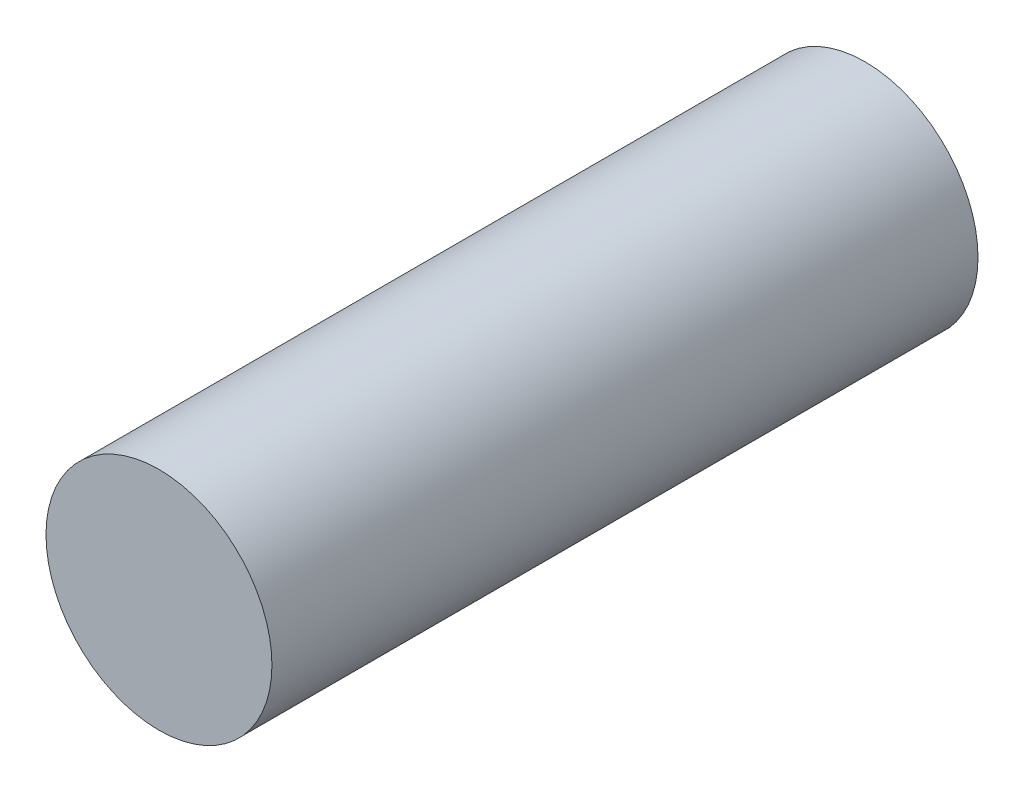
ISO-10303-21;
HEADER;
FILE_DESCRIPTION(('STEP AP214'),'2;1');
FILE_NAME('part.step','',(''),(''),'','','');
FILE_SCHEMA(('AUTOMOTIVE_DESIGN { 1 0 10303 214 1 1 1 1 }'));
ENDSEC;
DATA;
#1=APPLICATION_CONTEXT('core data for automotive mechanical design processes');
#2=APPLICATION_PROTOCOL_DEFINITION('international standard','automotive_design',2000,#1);
#3=PRODUCT_CONTEXT('',#1,'mechanical');
#4=PRODUCT('Part','Part','',(#3));
#5=PRODUCT_RELATED_PRODUCT_CATEGORY('part','',(#4));
#6=PRODUCT_DEFINITION_FORMATION('','',#4);
#7=PRODUCT_DEFINITION_CONTEXT('part definition',#1,'design');
#8=PRODUCT_DEFINITION('design','',#6,#7);
#9=PRODUCT_DEFINITION_SHAPE('','',#8);
#10=(LENGTH_UNIT() NAMED_UNIT(*) SI_UNIT(.MILLI.,.METRE.));
#11=(NAMED_UNIT(*) PLANE_ANGLE_UNIT() SI_UNIT($,.RADIAN.));
#12=(NAMED_UNIT(*) SI_UNIT($,.STERADIAN.) SOLID_ANGLE_UNIT());
#13=UNCERTAINTY_MEASURE_WITH_UNIT(LENGTH_MEASURE(1.E-05),#10,'distance_accuracy_value','');
#14=(GEOMETRIC_REPRESENTATION_CONTEXT(3) GLOBAL_UNCERTAINTY_ASSIGNED_CONTEXT((#13)) GLOBAL_UNIT_ASSIGNED_CONTEXT((#10,
#11,#12)) REPRESENTATION_CONTEXT('',''));
#15=CARTESIAN_POINT('',(0.,0.,0.));
#16=DIRECTION('',(0.,0.,1.));
#17=DIRECTION('',(1.,0.,0.));
#18=AXIS2_PLACEMENT_3D('',#15,#16,#17);
#19=CARTESIAN_POINT('',(0.,0.,25.));
#20=DIRECTION('',(0.,0.,-1.));
#21=DIRECTION('',(-1.,0.,0.));
#22=AXIS2_PLACEMENT_3D('',#19,#20,#21);
#23=CYLINDRICAL_SURFACE('',#22,4.);
#24=CARTESIAN_POINT('',(0.,0.,25.));
#25=DIRECTION('',(0.,0.,1.));
#26=DIRECTION('',(1.,0.,0.));
#27=AXIS2_PLACEMENT_3D('',#24,#25,#26);
#28=CIRCLE('',#27,4.);
#29=CARTESIAN_POINT('',(4.,0.,25.));
#30=VERTEX_POINT('',#29);
#31=EDGE_CURVE('E10',#30,#30,#28,.T.);
#32=ORIENTED_EDGE('',*,*,#31,.F.);
#33=EDGE_LOOP('',(#32));
#34=FACE_BOUND('',#33,.T.);
#35=CARTESIAN_POINT('',(0.,0.,0.));
#36=DIRECTION('',(0.,0.,1.));
#37=DIRECTION('',(1.,0.,0.));
#38=AXIS2_PLACEMENT_3D('',#35,#36,#37);
#39=CIRCLE('',#38,4.);
#40=CARTESIAN_POINT('',(4.,0.,0.));
#41=VERTEX_POINT('',#40);
#42=EDGE_CURVE('E36',#41,#41,#39,.T.);
#43=ORIENTED_EDGE('',*,*,#42,.T.);
#44=EDGE_LOOP('',(#43));
#45=FACE_BOUND('',#44,.T.);
#46=ADVANCED_FACE('F33',(#34,#45),#23,.T.);
#47=CARTESIAN_POINT('',(0.,0.,25.));
#48=DIRECTION('',(0.,0.,1.));
#49=DIRECTION('',(1.,0.,0.));
#50=AXIS2_PLACEMENT_3D('',#47,#48,#49);
#51=PLANE('',#50);
#52=ORIENTED_EDGE('',*,*,#31,.T.);
#53=EDGE_LOOP('',(#52));
#54=FACE_BOUND('',#53,.T.);
#55=ADVANCED_FACE('F48',(#54),#51,.T.);
#56=CARTESIAN_POINT('',(0.,0.,0.));
#57=DIRECTION('',(0.,0.,1.));
#58=DIRECTION('',(1.,0.,0.));
#59=AXIS2_PLACEMENT_3D('',#56,#57,#58);
#60=PLANE('',#59);
#61=ORIENTED_EDGE('',*,*,#42,.F.);
#62=EDGE_LOOP('',(#61));
#63=FACE_BOUND('',#62,.T.);
#64=ADVANCED_FACE('F46',(#63),#60,.F.);
#65=CLOSED_SHELL('',(#46,#55,#64));
#66=MANIFOLD_SOLID_BREP('B2',#65);
#67=ADVANCED_BREP_SHAPE_REPRESENTATION('',(#18,#66),#14);
#68=SHAPE_DEFINITION_REPRESENTATION(#9,#67);
ENDSEC;
END-ISO-10303-21;
